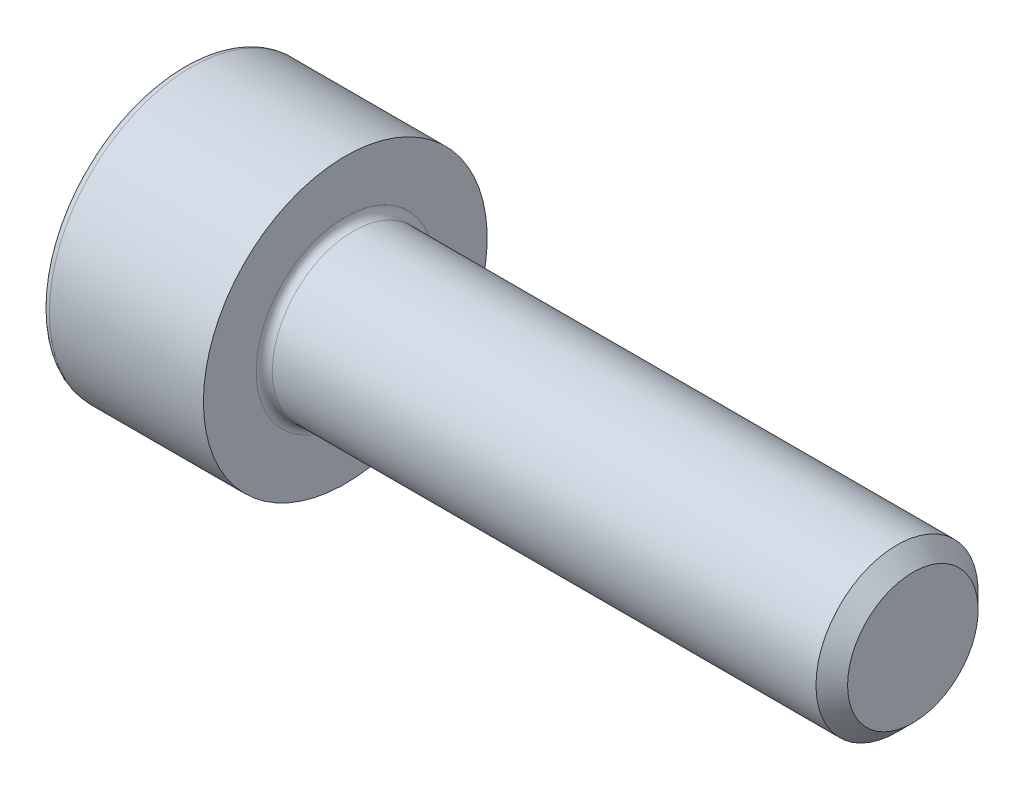
ISO-10303-21;
HEADER;
FILE_DESCRIPTION(('STEP AP214'),'2;1');
FILE_NAME('part.step','',(''),(''),'','','');
FILE_SCHEMA(('AUTOMOTIVE_DESIGN { 1 0 10303 214 1 1 1 1 }'));
ENDSEC;
DATA;
#1=APPLICATION_CONTEXT('core data for automotive mechanical design processes');
#2=APPLICATION_PROTOCOL_DEFINITION('international standard','automotive_design',2000,#1);
#3=PRODUCT_CONTEXT('',#1,'mechanical');
#4=PRODUCT('Part','Part','',(#3));
#5=PRODUCT_RELATED_PRODUCT_CATEGORY('part','',(#4));
#6=PRODUCT_DEFINITION_FORMATION('','',#4);
#7=PRODUCT_DEFINITION_CONTEXT('part definition',#1,'design');
#8=PRODUCT_DEFINITION('design','',#6,#7);
#9=PRODUCT_DEFINITION_SHAPE('','',#8);
#10=(LENGTH_UNIT() NAMED_UNIT(*) SI_UNIT(.MILLI.,.METRE.));
#11=(NAMED_UNIT(*) PLANE_ANGLE_UNIT() SI_UNIT($,.RADIAN.));
#12=(NAMED_UNIT(*) SI_UNIT($,.STERADIAN.) SOLID_ANGLE_UNIT());
#13=UNCERTAINTY_MEASURE_WITH_UNIT(LENGTH_MEASURE(1.E-05),#10,'distance_accuracy_value','');
#14=(GEOMETRIC_REPRESENTATION_CONTEXT(3) GLOBAL_UNCERTAINTY_ASSIGNED_CONTEXT((#13)) GLOBAL_UNIT_ASSIGNED_CONTEXT((#10,
#11,#12)) REPRESENTATION_CONTEXT('',''));
#15=CARTESIAN_POINT('',(0.,0.,0.));
#16=DIRECTION('',(0.,0.,1.));
#17=DIRECTION('',(1.,0.,0.));
#18=AXIS2_PLACEMENT_3D('',#15,#16,#17);
#19=CARTESIAN_POINT('',(2.,0.,0.));
#20=DIRECTION('',(-1.,0.,0.));
#21=DIRECTION('',(0.,0.,1.));
#22=AXIS2_PLACEMENT_3D('',#19,#20,#21);
#23=PLANE('',#22);
#24=DIRECTION('',(0.,-1.,0.));
#25=VECTOR('',#24,1.);
#26=CARTESIAN_POINT('',(2.,0.886521338340666,-1.5355));
#27=LINE('',#26,#25);
#28=CARTESIAN_POINT('',(2.,0.886521338340666,-1.5355));
#29=VERTEX_POINT('',#28);
#30=CARTESIAN_POINT('',(2.,0.,-1.5355));
#31=VERTEX_POINT('',#30);
#32=EDGE_CURVE('E174',#29,#31,#27,.T.);
#33=ORIENTED_EDGE('',*,*,#32,.T.);
#34=CARTESIAN_POINT('',(2.,0.,0.));
#35=DIRECTION('',(1.,0.,0.));
#36=DIRECTION('',(0.,0.,-1.));
#37=AXIS2_PLACEMENT_3D('',#34,#35,#36);
#38=CIRCLE('',#37,1.5355);
#39=CARTESIAN_POINT('',(2.,1.329782007511,-0.767750000000004));
#40=VERTEX_POINT('',#39);
#41=EDGE_CURVE('E47',#31,#40,#38,.T.);
#42=ORIENTED_EDGE('',*,*,#41,.T.);
#43=DIRECTION('',(0.,-0.500000000000003,-0.866025403784437));
#44=VECTOR('',#43,1.);
#45=CARTESIAN_POINT('',(2.,1.77304267668134,0.));
#46=LINE('',#45,#44);
#47=EDGE_CURVE('E170',#40,#29,#46,.T.);
#48=ORIENTED_EDGE('',*,*,#47,.T.);
#49=EDGE_LOOP('',(#33,#42,#48));
#50=FACE_BOUND('',#49,.T.);
#51=ADVANCED_FACE('F32',(#50),#23,.T.);
#52=CARTESIAN_POINT('',(2.,1.77304267668134,0.));
#53=VERTEX_POINT('',#52);
#54=EDGE_CURVE('E171',#53,#40,#46,.T.);
#55=ORIENTED_EDGE('',*,*,#54,.T.);
#56=CARTESIAN_POINT('',(2.,1.32978200751101,0.767749999999999));
#57=VERTEX_POINT('',#56);
#58=EDGE_CURVE('E210',#40,#57,#38,.T.);
#59=ORIENTED_EDGE('',*,*,#58,.T.);
#60=DIRECTION('',(0.,0.499999999999999,-0.866025403784439));
#61=VECTOR('',#60,1.);
#62=CARTESIAN_POINT('',(2.,0.886521338340669,1.5355));
#63=LINE('',#62,#61);
#64=EDGE_CURVE('E166',#57,#53,#63,.T.);
#65=ORIENTED_EDGE('',*,*,#64,.T.);
#66=EDGE_LOOP('',(#55,#59,#65));
#67=FACE_BOUND('',#66,.T.);
#68=ADVANCED_FACE('F122',(#67),#23,.T.);
#69=CARTESIAN_POINT('',(2.,0.886521338340669,1.5355));
#70=VERTEX_POINT('',#69);
#71=EDGE_CURVE('E167',#70,#57,#63,.T.);
#72=ORIENTED_EDGE('',*,*,#71,.T.);
#73=CARTESIAN_POINT('',(2.,0.,1.5355));
#74=VERTEX_POINT('',#73);
#75=EDGE_CURVE('E284',#57,#74,#38,.T.);
#76=ORIENTED_EDGE('',*,*,#75,.T.);
#77=DIRECTION('',(0.,1.,0.));
#78=VECTOR('',#77,1.);
#79=CARTESIAN_POINT('',(2.,-0.886521338340673,1.5355));
#80=LINE('',#79,#78);
#81=EDGE_CURVE('E162',#74,#70,#80,.T.);
#82=ORIENTED_EDGE('',*,*,#81,.T.);
#83=EDGE_LOOP('',(#72,#76,#82));
#84=FACE_BOUND('',#83,.T.);
#85=ADVANCED_FACE('F128',(#84),#23,.T.);
#86=CARTESIAN_POINT('',(2.,-0.886521338340673,1.5355));
#87=VERTEX_POINT('',#86);
#88=EDGE_CURVE('E163',#87,#74,#80,.T.);
#89=ORIENTED_EDGE('',*,*,#88,.T.);
#90=CARTESIAN_POINT('',(2.,-1.32978200751101,0.767750000000001));
#91=VERTEX_POINT('',#90);
#92=EDGE_CURVE('E283',#74,#91,#38,.T.);
#93=ORIENTED_EDGE('',*,*,#92,.T.);
#94=DIRECTION('',(0.,0.500000000000001,0.866025403784438));
#95=VECTOR('',#94,1.);
#96=CARTESIAN_POINT('',(2.,-1.77304267668134,0.));
#97=LINE('',#96,#95);
#98=EDGE_CURVE('E153',#91,#87,#97,.T.);
#99=ORIENTED_EDGE('',*,*,#98,.T.);
#100=EDGE_LOOP('',(#89,#93,#99));
#101=FACE_BOUND('',#100,.T.);
#102=ADVANCED_FACE('F143',(#101),#23,.T.);
#103=CARTESIAN_POINT('',(2.,-1.77304267668134,0.));
#104=VERTEX_POINT('',#103);
#105=EDGE_CURVE('E156',#104,#91,#97,.T.);
#106=ORIENTED_EDGE('',*,*,#105,.T.);
#107=CARTESIAN_POINT('',(2.,-1.32978200751101,-0.76775));
#108=VERTEX_POINT('',#107);
#109=EDGE_CURVE('E281',#91,#108,#38,.T.);
#110=ORIENTED_EDGE('',*,*,#109,.T.);
#111=DIRECTION('',(0.,-0.5,0.866025403784439));
#112=VECTOR('',#111,1.);
#113=CARTESIAN_POINT('',(2.,-0.886521338340676,-1.5355));
#114=LINE('',#113,#112);
#115=EDGE_CURVE('E154',#108,#104,#114,.T.);
#116=ORIENTED_EDGE('',*,*,#115,.T.);
#117=EDGE_LOOP('',(#106,#110,#116));
#118=FACE_BOUND('',#117,.T.);
#119=ADVANCED_FACE('F134',(#118),#23,.T.);
#120=CARTESIAN_POINT('',(2.,-0.886521338340676,-1.5355));
#121=VERTEX_POINT('',#120);
#122=EDGE_CURVE('E147',#121,#108,#114,.T.);
#123=ORIENTED_EDGE('',*,*,#122,.T.);
#124=EDGE_CURVE('E148',#108,#31,#38,.T.);
#125=ORIENTED_EDGE('',*,*,#124,.T.);
#126=EDGE_CURVE('E150',#31,#121,#27,.T.);
#127=ORIENTED_EDGE('',*,*,#126,.T.);
#128=EDGE_LOOP('',(#123,#125,#127));
#129=FACE_BOUND('',#128,.T.);
#130=ADVANCED_FACE('F124',(#129),#23,.T.);
#131=CARTESIAN_POINT('',(4.,3.5,0.));
#132=DIRECTION('',(1.,0.,0.));
#133=DIRECTION('',(0.,0.,-1.));
#134=AXIS2_PLACEMENT_3D('',#131,#132,#133);
#135=PLANE('',#134);
#136=CARTESIAN_POINT('',(4.,0.,0.));
#137=DIRECTION('',(1.,0.,0.));
#138=DIRECTION('',(0.,0.,-1.));
#139=AXIS2_PLACEMENT_3D('',#136,#137,#138);
#140=CIRCLE('',#139,2.19999999999996);
#141=CARTESIAN_POINT('',(4.,0.,-2.19999999999996));
#142=VERTEX_POINT('',#141);
#143=EDGE_CURVE('E11',#142,#142,#140,.F.);
#144=ORIENTED_EDGE('',*,*,#143,.T.);
#145=EDGE_LOOP('',(#144));
#146=FACE_BOUND('',#145,.T.);
#147=CARTESIAN_POINT('',(4.,0.,0.));
#148=DIRECTION('',(-1.,0.,0.));
#149=DIRECTION('',(0.,0.,1.));
#150=AXIS2_PLACEMENT_3D('',#147,#148,#149);
#151=CIRCLE('',#150,3.5);
#152=CARTESIAN_POINT('',(4.,0.,3.5));
#153=VERTEX_POINT('',#152);
#154=EDGE_CURVE('E194',#153,#153,#151,.T.);
#155=ORIENTED_EDGE('',*,*,#154,.F.);
#156=EDGE_LOOP('',(#155));
#157=FACE_BOUND('',#156,.T.);
#158=ADVANCED_FACE('F133',(#146,#157),#135,.T.);
#159=CARTESIAN_POINT('',(4.,0.,0.));
#160=DIRECTION('',(-1.,0.,0.));
#161=DIRECTION('',(0.,0.,1.));
#162=AXIS2_PLACEMENT_3D('',#159,#160,#161);
#163=CYLINDRICAL_SURFACE('',#162,3.5);
#164=CARTESIAN_POINT('',(0.2,0.,0.));
#165=DIRECTION('',(-1.,0.,0.));
#166=DIRECTION('',(0.,0.,1.));
#167=AXIS2_PLACEMENT_3D('',#164,#165,#166);
#168=CIRCLE('',#167,3.5);
#169=CARTESIAN_POINT('',(0.2,0.,3.5));
#170=VERTEX_POINT('',#169);
#171=EDGE_CURVE('E216',#170,#170,#168,.F.);
#172=ORIENTED_EDGE('',*,*,#171,.T.);
#173=EDGE_LOOP('',(#172));
#174=FACE_BOUND('',#173,.T.);
#175=ORIENTED_EDGE('',*,*,#154,.T.);
#176=EDGE_LOOP('',(#175));
#177=FACE_BOUND('',#176,.T.);
#178=ADVANCED_FACE('F140',(#174,#177),#163,.T.);
#179=CARTESIAN_POINT('',(0.,0.,0.));
#180=DIRECTION('',(-1.,0.,0.));
#181=DIRECTION('',(0.,0.,1.));
#182=AXIS2_PLACEMENT_3D('',#179,#180,#181);
#183=PLANE('',#182);
#184=CARTESIAN_POINT('',(0.,0.,0.));
#185=DIRECTION('',(-1.,0.,0.));
#186=DIRECTION('',(0.,0.,1.));
#187=AXIS2_PLACEMENT_3D('',#184,#185,#186);
#188=CIRCLE('',#187,3.3);
#189=CARTESIAN_POINT('',(0.,0.,3.3));
#190=VERTEX_POINT('',#189);
#191=EDGE_CURVE('E213',#190,#190,#188,.T.);
#192=ORIENTED_EDGE('',*,*,#191,.T.);
#193=EDGE_LOOP('',(#192));
#194=FACE_BOUND('',#193,.T.);
#195=DIRECTION('',(0.,-0.5,0.866025403784439));
#196=VECTOR('',#195,1.);
#197=CARTESIAN_POINT('',(0.,-0.886521338340676,-1.5355));
#198=LINE('',#197,#196);
#199=CARTESIAN_POINT('',(0.,-0.886521338340676,-1.5355));
#200=VERTEX_POINT('',#199);
#201=CARTESIAN_POINT('',(0.,-1.77304267668135,0.));
#202=VERTEX_POINT('',#201);
#203=EDGE_CURVE('E55',#200,#202,#198,.T.);
#204=ORIENTED_EDGE('',*,*,#203,.F.);
#205=DIRECTION('',(0.,-1.,0.));
#206=VECTOR('',#205,1.);
#207=CARTESIAN_POINT('',(0.,0.886521338340666,-1.5355));
#208=LINE('',#207,#206);
#209=CARTESIAN_POINT('',(0.,0.886521338340666,-1.5355));
#210=VERTEX_POINT('',#209);
#211=EDGE_CURVE('E158',#210,#200,#208,.T.);
#212=ORIENTED_EDGE('',*,*,#211,.F.);
#213=DIRECTION('',(0.,-0.500000000000003,-0.866025403784437));
#214=VECTOR('',#213,1.);
#215=CARTESIAN_POINT('',(0.,1.77304267668134,0.));
#216=LINE('',#215,#214);
#217=CARTESIAN_POINT('',(0.,1.77304267668134,0.));
#218=VERTEX_POINT('',#217);
#219=EDGE_CURVE('E187',#218,#210,#216,.T.);
#220=ORIENTED_EDGE('',*,*,#219,.F.);
#221=DIRECTION('',(0.,0.499999999999999,-0.866025403784439));
#222=VECTOR('',#221,1.);
#223=CARTESIAN_POINT('',(0.,0.886521338340669,1.5355));
#224=LINE('',#223,#222);
#225=CARTESIAN_POINT('',(0.,0.886521338340669,1.5355));
#226=VERTEX_POINT('',#225);
#227=EDGE_CURVE('E184',#226,#218,#224,.T.);
#228=ORIENTED_EDGE('',*,*,#227,.F.);
#229=DIRECTION('',(0.,1.,0.));
#230=VECTOR('',#229,1.);
#231=CARTESIAN_POINT('',(0.,-0.886521338340673,1.5355));
#232=LINE('',#231,#230);
#233=CARTESIAN_POINT('',(0.,-0.886521338340673,1.5355));
#234=VERTEX_POINT('',#233);
#235=EDGE_CURVE('E181',#234,#226,#232,.T.);
#236=ORIENTED_EDGE('',*,*,#235,.F.);
#237=DIRECTION('',(0.,0.500000000000001,0.866025403784438));
#238=VECTOR('',#237,1.);
#239=CARTESIAN_POINT('',(0.,-1.77304267668134,0.));
#240=LINE('',#239,#238);
#241=EDGE_CURVE('E178',#202,#234,#240,.T.);
#242=ORIENTED_EDGE('',*,*,#241,.F.);
#243=EDGE_LOOP('',(#204,#212,#220,#228,#236,#242));
#244=FACE_BOUND('',#243,.T.);
#245=ADVANCED_FACE('F235',(#194,#244),#183,.T.);
#246=CARTESIAN_POINT('',(18.,0.,0.));
#247=DIRECTION('',(-1.,0.,0.));
#248=DIRECTION('',(0.,0.,1.));
#249=AXIS2_PLACEMENT_3D('',#246,#247,#248);
#250=CYLINDRICAL_SURFACE('',#249,1.99999999999996);
#251=CARTESIAN_POINT('',(4.2,0.,0.));
#252=DIRECTION('',(1.,0.,0.));
#253=DIRECTION('',(0.,0.,-1.));
#254=AXIS2_PLACEMENT_3D('',#251,#252,#253);
#255=CIRCLE('',#254,1.99999999999996);
#256=CARTESIAN_POINT('',(4.2,0.,1.99999999999996));
#257=VERTEX_POINT('',#256);
#258=EDGE_CURVE('E40',#257,#257,#255,.T.);
#259=CARTESIAN_POINT('',(17.6100000000001,0.,0.));
#260=DIRECTION('',(1.,0.,0.));
#261=DIRECTION('',(0.,0.,-1.));
#262=AXIS2_PLACEMENT_3D('',#259,#260,#261);
#263=CIRCLE('',#262,1.99999999999996);
#264=CARTESIAN_POINT('',(17.6100000000001,0.,1.99999999999996));
#265=VERTEX_POINT('',#264);
#266=EDGE_CURVE('E209',#265,#265,#263,.F.);
#267=CARTESIAN_POINT('',(4.2,0.,1.99999999999996));
#268=CARTESIAN_POINT('',(4.3396875,0.,1.99999999999996));
#269=CARTESIAN_POINT('',(4.479375,0.,1.99999999999996));
#270=CARTESIAN_POINT('',(4.75875,0.,1.99999999999996));
#271=CARTESIAN_POINT('',(4.8984375,0.,1.99999999999996));
#272=CARTESIAN_POINT('',(5.17781250000001,0.,1.99999999999996));
#273=CARTESIAN_POINT('',(5.31750000000001,0.,1.99999999999996));
#274=CARTESIAN_POINT('',(5.59687500000001,0.,1.99999999999996));
#275=CARTESIAN_POINT('',(5.73656250000001,0.,1.99999999999996));
#276=CARTESIAN_POINT('',(6.01593750000001,0.,1.99999999999996));
#277=CARTESIAN_POINT('',(6.15562500000002,0.,1.99999999999996));
#278=CARTESIAN_POINT('',(6.43500000000002,0.,1.99999999999996));
#279=CARTESIAN_POINT('',(6.57468750000002,0.,1.99999999999996));
#280=CARTESIAN_POINT('',(6.85406250000002,0.,1.99999999999996));
#281=CARTESIAN_POINT('',(6.99375000000003,0.,1.99999999999996));
#282=CARTESIAN_POINT('',(7.27312500000003,0.,1.99999999999996));
#283=CARTESIAN_POINT('',(7.41281250000003,0.,1.99999999999996));
#284=CARTESIAN_POINT('',(7.69218750000003,0.,1.99999999999996));
#285=CARTESIAN_POINT('',(7.83187500000003,0.,1.99999999999996));
#286=CARTESIAN_POINT('',(8.11125000000004,0.,1.99999999999996));
#287=CARTESIAN_POINT('',(8.25093750000004,0.,1.99999999999996));
#288=CARTESIAN_POINT('',(8.53031250000004,0.,1.99999999999996));
#289=CARTESIAN_POINT('',(8.67000000000004,0.,1.99999999999996));
#290=CARTESIAN_POINT('',(8.94937500000004,0.,1.99999999999996));
#291=CARTESIAN_POINT('',(9.08906250000005,0.,1.99999999999996));
#292=CARTESIAN_POINT('',(9.36843750000005,0.,1.99999999999996));
#293=CARTESIAN_POINT('',(9.50812500000005,0.,1.99999999999996));
#294=CARTESIAN_POINT('',(9.78750000000005,0.,1.99999999999996));
#295=CARTESIAN_POINT('',(9.92718750000006,0.,1.99999999999996));
#296=CARTESIAN_POINT('',(10.2065625000001,0.,1.99999999999996));
#297=CARTESIAN_POINT('',(10.3462500000001,0.,1.99999999999996));
#298=CARTESIAN_POINT('',(10.6256250000001,0.,1.99999999999996));
#299=CARTESIAN_POINT('',(10.7653125000001,0.,1.99999999999996));
#300=CARTESIAN_POINT('',(11.0446875000001,0.,1.99999999999996));
#301=CARTESIAN_POINT('',(11.1843750000001,0.,1.99999999999996));
#302=CARTESIAN_POINT('',(11.4637500000001,0.,1.99999999999996));
#303=CARTESIAN_POINT('',(11.6034375000001,0.,1.99999999999996));
#304=CARTESIAN_POINT('',(11.8828125000001,0.,1.99999999999996));
#305=CARTESIAN_POINT('',(12.0225000000001,0.,1.99999999999996));
#306=CARTESIAN_POINT('',(12.3018750000001,0.,1.99999999999996));
#307=CARTESIAN_POINT('',(12.4415625000001,0.,1.99999999999996));
#308=CARTESIAN_POINT('',(12.7209375000001,0.,1.99999999999996));
#309=CARTESIAN_POINT('',(12.8606250000001,0.,1.99999999999996));
#310=CARTESIAN_POINT('',(13.1400000000001,0.,1.99999999999996));
#311=CARTESIAN_POINT('',(13.2796875000001,0.,1.99999999999996));
#312=CARTESIAN_POINT('',(13.5590625000001,0.,1.99999999999996));
#313=CARTESIAN_POINT('',(13.6987500000001,0.,1.99999999999996));
#314=CARTESIAN_POINT('',(13.9781250000001,0.,1.99999999999996));
#315=CARTESIAN_POINT('',(14.1178125000001,0.,1.99999999999996));
#316=CARTESIAN_POINT('',(14.3971875000001,0.,1.99999999999996));
#317=CARTESIAN_POINT('',(14.5368750000001,0.,1.99999999999996));
#318=CARTESIAN_POINT('',(14.8162500000001,0.,1.99999999999996));
#319=CARTESIAN_POINT('',(14.9559375000001,0.,1.99999999999996));
#320=CARTESIAN_POINT('',(15.2353125000001,0.,1.99999999999996));
#321=CARTESIAN_POINT('',(15.3750000000001,0.,1.99999999999996));
#322=CARTESIAN_POINT('',(15.6543750000001,0.,1.99999999999996));
#323=CARTESIAN_POINT('',(15.7940625000001,0.,1.99999999999996));
#324=CARTESIAN_POINT('',(16.0734375000001,0.,1.99999999999996));
#325=CARTESIAN_POINT('',(16.2131250000001,0.,1.99999999999996));
#326=CARTESIAN_POINT('',(16.4925000000001,0.,1.99999999999996));
#327=CARTESIAN_POINT('',(16.6321875000001,0.,1.99999999999996));
#328=CARTESIAN_POINT('',(16.9115625000001,0.,1.99999999999996));
#329=CARTESIAN_POINT('',(17.0512500000001,0.,1.99999999999996));
#330=CARTESIAN_POINT('',(17.3306250000001,0.,1.99999999999996));
#331=CARTESIAN_POINT('',(17.4703125000001,0.,1.99999999999996));
#332=CARTESIAN_POINT('',(17.6100000000001,0.,1.99999999999996));
#333=B_SPLINE_CURVE_WITH_KNOTS('',3,(#267,#268,#269,#270,#271,#272,#273,#274,#275,#276,#277,
#278,#279,#280,#281,#282,#283,#284,#285,#286,#287,#288,#289,#290,#291,#292,#293,#294,#295,#296,
#297,#298,#299,#300,#301,#302,#303,#304,#305,#306,#307,#308,#309,#310,#311,#312,#313,#314,#315,
#316,#317,#318,#319,#320,#321,#322,#323,#324,#325,#326,#327,#328,#329,#330,#331,#332),
.UNSPECIFIED.,.F.,.F.,(4,2,2,2,2,2,2,2,2,2,2,2,2,2,2,2,2,2,2,2,2,2,2,2,2,2,2,2,2,2,2,2,4),(0.,
0.419062500000005,0.838125000000009,1.25718750000001,1.67625000000002,2.09531250000002,
2.51437500000003,2.93343750000003,3.35250000000003,3.77156250000004,4.19062500000004,
4.60968750000005,5.02875000000005,5.44781250000006,5.86687500000006,6.28593750000006,
6.70500000000007,7.12406250000007,7.54312500000008,7.96218750000008,8.38125000000008,
8.80031250000009,9.21937500000009,9.63843750000009,10.0575000000001,10.4765625000001,
10.8956250000001,11.3146875000001,11.7337500000001,12.1528125000001,12.5718750000001,
12.9909375000001,13.4100000000001),.UNSPECIFIED.);
#334=EDGE_CURVE('BSEAM221',#257,#265,#333,.T.);
#335=ORIENTED_EDGE('',*,*,#258,.T.);
#336=ORIENTED_EDGE('',*,*,#266,.T.);
#337=ORIENTED_EDGE('',*,*,#334,.T.);
#338=ORIENTED_EDGE('',*,*,#334,.F.);
#339=EDGE_LOOP('',(#335,#337,#336,#338));
#340=FACE_BOUND('',#339,.T.);
#341=ADVANCED_FACE('F221',(#340),#250,.T.);
#342=CARTESIAN_POINT('',(18.,0.,0.));
#343=DIRECTION('',(1.,0.,0.));
#344=DIRECTION('',(0.,0.,-1.));
#345=AXIS2_PLACEMENT_3D('',#342,#343,#344);
#346=PLANE('',#345);
#347=CARTESIAN_POINT('',(18.,0.,0.));
#348=DIRECTION('',(1.,0.,0.));
#349=DIRECTION('',(0.,0.,-1.));
#350=AXIS2_PLACEMENT_3D('',#347,#348,#349);
#351=CIRCLE('',#350,1.60999999999994);
#352=CARTESIAN_POINT('',(18.,0.,1.60999999999994));
#353=VERTEX_POINT('',#352);
#354=EDGE_CURVE('E206',#353,#353,#351,.T.);
#355=ORIENTED_EDGE('',*,*,#354,.T.);
#356=EDGE_LOOP('',(#355));
#357=FACE_BOUND('',#356,.T.);
#358=ADVANCED_FACE('F246',(#357),#346,.T.);
#359=CARTESIAN_POINT('',(2.,-0.886521338340676,-1.5355));
#360=DIRECTION('',(0.,-0.866025403784439,-0.5));
#361=DIRECTION('',(0.,0.5,-0.866025403784439));
#362=AXIS2_PLACEMENT_3D('',#359,#360,#361);
#363=PLANE('',#362);
#364=ORIENTED_EDGE('',*,*,#203,.T.);
#365=DIRECTION('',(-1.,0.,0.));
#366=VECTOR('',#365,1.);
#367=CARTESIAN_POINT('',(2.,-1.77304267668134,0.));
#368=LINE('',#367,#366);
#369=EDGE_CURVE('E176',#104,#202,#368,.T.);
#370=ORIENTED_EDGE('',*,*,#369,.F.);
#371=ORIENTED_EDGE('',*,*,#115,.F.);
#372=ORIENTED_EDGE('',*,*,#122,.F.);
#373=DIRECTION('',(-1.,0.,0.));
#374=VECTOR('',#373,1.);
#375=CARTESIAN_POINT('',(2.,-0.886521338340676,-1.5355));
#376=LINE('',#375,#374);
#377=EDGE_CURVE('E192',#121,#200,#376,.T.);
#378=ORIENTED_EDGE('',*,*,#377,.T.);
#379=EDGE_LOOP('',(#364,#370,#371,#372,#378));
#380=FACE_BOUND('',#379,.T.);
#381=ADVANCED_FACE('F249',(#380),#363,.F.);
#382=CARTESIAN_POINT('',(2.,0.886521338340666,-1.5355));
#383=DIRECTION('',(0.,0.,-1.));
#384=DIRECTION('',(-1.,0.,0.));
#385=AXIS2_PLACEMENT_3D('',#382,#383,#384);
#386=PLANE('',#385);
#387=ORIENTED_EDGE('',*,*,#211,.T.);
#388=ORIENTED_EDGE('',*,*,#377,.F.);
#389=ORIENTED_EDGE('',*,*,#126,.F.);
#390=ORIENTED_EDGE('',*,*,#32,.F.);
#391=DIRECTION('',(-1.,0.,0.));
#392=VECTOR('',#391,1.);
#393=CARTESIAN_POINT('',(2.,0.886521338340666,-1.5355));
#394=LINE('',#393,#392);
#395=EDGE_CURVE('E195',#29,#210,#394,.T.);
#396=ORIENTED_EDGE('',*,*,#395,.T.);
#397=EDGE_LOOP('',(#387,#388,#389,#390,#396));
#398=FACE_BOUND('',#397,.T.);
#399=ADVANCED_FACE('F252',(#398),#386,.F.);
#400=CARTESIAN_POINT('',(2.,1.77304267668134,0.));
#401=DIRECTION('',(0.,0.866025403784437,-0.500000000000003));
#402=DIRECTION('',(0.,0.500000000000003,0.866025403784437));
#403=AXIS2_PLACEMENT_3D('',#400,#401,#402);
#404=PLANE('',#403);
#405=ORIENTED_EDGE('',*,*,#219,.T.);
#406=ORIENTED_EDGE('',*,*,#395,.F.);
#407=ORIENTED_EDGE('',*,*,#47,.F.);
#408=ORIENTED_EDGE('',*,*,#54,.F.);
#409=DIRECTION('',(-1.,0.,0.));
#410=VECTOR('',#409,1.);
#411=CARTESIAN_POINT('',(2.,1.77304267668134,0.));
#412=LINE('',#411,#410);
#413=EDGE_CURVE('E197',#53,#218,#412,.T.);
#414=ORIENTED_EDGE('',*,*,#413,.T.);
#415=EDGE_LOOP('',(#405,#406,#407,#408,#414));
#416=FACE_BOUND('',#415,.T.);
#417=ADVANCED_FACE('F260',(#416),#404,.F.);
#418=CARTESIAN_POINT('',(2.,0.886521338340669,1.5355));
#419=DIRECTION('',(0.,0.866025403784439,0.499999999999999));
#420=DIRECTION('',(0.,-0.499999999999999,0.866025403784439));
#421=AXIS2_PLACEMENT_3D('',#418,#419,#420);
#422=PLANE('',#421);
#423=ORIENTED_EDGE('',*,*,#227,.T.);
#424=ORIENTED_EDGE('',*,*,#413,.F.);
#425=ORIENTED_EDGE('',*,*,#64,.F.);
#426=ORIENTED_EDGE('',*,*,#71,.F.);
#427=DIRECTION('',(-1.,0.,0.));
#428=VECTOR('',#427,1.);
#429=CARTESIAN_POINT('',(2.,0.886521338340669,1.5355));
#430=LINE('',#429,#428);
#431=EDGE_CURVE('E199',#70,#226,#430,.T.);
#432=ORIENTED_EDGE('',*,*,#431,.T.);
#433=EDGE_LOOP('',(#423,#424,#425,#426,#432));
#434=FACE_BOUND('',#433,.T.);
#435=ADVANCED_FACE('F256',(#434),#422,.F.);
#436=CARTESIAN_POINT('',(2.,-0.886521338340673,1.5355));
#437=DIRECTION('',(0.,0.,1.));
#438=DIRECTION('',(1.,0.,0.));
#439=AXIS2_PLACEMENT_3D('',#436,#437,#438);
#440=PLANE('',#439);
#441=ORIENTED_EDGE('',*,*,#235,.T.);
#442=ORIENTED_EDGE('',*,*,#431,.F.);
#443=ORIENTED_EDGE('',*,*,#81,.F.);
#444=ORIENTED_EDGE('',*,*,#88,.F.);
#445=DIRECTION('',(-1.,0.,0.));
#446=VECTOR('',#445,1.);
#447=CARTESIAN_POINT('',(2.,-0.886521338340673,1.5355));
#448=LINE('',#447,#446);
#449=EDGE_CURVE('E201',#87,#234,#448,.T.);
#450=ORIENTED_EDGE('',*,*,#449,.T.);
#451=EDGE_LOOP('',(#441,#442,#443,#444,#450));
#452=FACE_BOUND('',#451,.T.);
#453=ADVANCED_FACE('F117',(#452),#440,.F.);
#454=CARTESIAN_POINT('',(2.,-1.77304267668134,0.));
#455=DIRECTION('',(0.,-0.866025403784438,0.500000000000001));
#456=DIRECTION('',(0.,-0.500000000000001,-0.866025403784438));
#457=AXIS2_PLACEMENT_3D('',#454,#455,#456);
#458=PLANE('',#457);
#459=ORIENTED_EDGE('',*,*,#241,.T.);
#460=ORIENTED_EDGE('',*,*,#449,.F.);
#461=ORIENTED_EDGE('',*,*,#98,.F.);
#462=ORIENTED_EDGE('',*,*,#105,.F.);
#463=ORIENTED_EDGE('',*,*,#369,.T.);
#464=EDGE_LOOP('',(#459,#460,#461,#462,#463));
#465=FACE_BOUND('',#464,.T.);
#466=ADVANCED_FACE('F108',(#465),#458,.F.);
#467=CARTESIAN_POINT('',(2.88652133834068,0.,0.));
#468=DIRECTION('',(-1.,0.,0.));
#469=DIRECTION('',(0.,0.,1.));
#470=AXIS2_PLACEMENT_3D('',#467,#468,#469);
#471=CONICAL_SURFACE('',#470,0.,1.04719755119659);
#472=ORIENTED_EDGE('',*,*,#41,.F.);
#473=ORIENTED_EDGE('',*,*,#124,.F.);
#474=ORIENTED_EDGE('',*,*,#109,.F.);
#475=ORIENTED_EDGE('',*,*,#92,.F.);
#476=ORIENTED_EDGE('',*,*,#75,.F.);
#477=ORIENTED_EDGE('',*,*,#58,.F.);
#478=EDGE_LOOP('',(#472,#473,#474,#475,#476,#477));
#479=FACE_BOUND('',#478,.T.);
#480=CARTESIAN_POINT('',(2.88652133834068,0.,0.));
#481=VERTEX_POINT('',#480);
#482=VERTEX_LOOP('',#481);
#483=FACE_BOUND('',#482,.T.);
#484=ADVANCED_FACE('F105',(#479,#483),#471,.F.);
#485=CARTESIAN_POINT('',(18.,0.,0.));
#486=DIRECTION('',(-1.,0.,0.));
#487=DIRECTION('',(0.,0.,1.));
#488=AXIS2_PLACEMENT_3D('',#485,#486,#487);
#489=CONICAL_SURFACE('',#488,1.60999999999994,0.785398163397651);
#490=CARTESIAN_POINT('',(17.6100000000001,0.,1.99999999999996));
#491=CARTESIAN_POINT('',(17.6140625000001,0.,1.99593749999996));
#492=CARTESIAN_POINT('',(17.6181250000001,0.,1.99187499999996));
#493=CARTESIAN_POINT('',(17.6262500000001,0.,1.98374999999996));
#494=CARTESIAN_POINT('',(17.6303125000001,0.,1.97968749999996));
#495=CARTESIAN_POINT('',(17.6384375000001,0.,1.97156249999996));
#496=CARTESIAN_POINT('',(17.6425000000001,0.,1.96749999999996));
#497=CARTESIAN_POINT('',(17.6506250000001,0.,1.95937499999996));
#498=CARTESIAN_POINT('',(17.6546875000001,0.,1.95531249999996));
#499=CARTESIAN_POINT('',(17.6628125000001,0.,1.94718749999996));
#500=CARTESIAN_POINT('',(17.6668750000001,0.,1.94312499999996));
#501=CARTESIAN_POINT('',(17.6750000000001,0.,1.93499999999996));
#502=CARTESIAN_POINT('',(17.6790625000001,0.,1.93093749999996));
#503=CARTESIAN_POINT('',(17.6871875000001,0.,1.92281249999996));
#504=CARTESIAN_POINT('',(17.6912500000001,0.,1.91874999999996));
#505=CARTESIAN_POINT('',(17.6993750000001,0.,1.91062499999996));
#506=CARTESIAN_POINT('',(17.7034375000001,0.,1.90656249999996));
#507=CARTESIAN_POINT('',(17.7115625000001,0.,1.89843749999996));
#508=CARTESIAN_POINT('',(17.7156250000001,0.,1.89437499999996));
#509=CARTESIAN_POINT('',(17.7237500000001,0.,1.88624999999996));
#510=CARTESIAN_POINT('',(17.7278125000001,0.,1.88218749999995));
#511=CARTESIAN_POINT('',(17.7359375000001,0.,1.87406249999995));
#512=CARTESIAN_POINT('',(17.7400000000001,0.,1.86999999999995));
#513=CARTESIAN_POINT('',(17.7481250000001,0.,1.86187499999995));
#514=CARTESIAN_POINT('',(17.7521875000001,0.,1.85781249999995));
#515=CARTESIAN_POINT('',(17.7603125000001,0.,1.84968749999995));
#516=CARTESIAN_POINT('',(17.7643750000001,0.,1.84562499999995));
#517=CARTESIAN_POINT('',(17.7725000000001,0.,1.83749999999995));
#518=CARTESIAN_POINT('',(17.7765625000001,0.,1.83343749999995));
#519=CARTESIAN_POINT('',(17.7846875000001,0.,1.82531249999995));
#520=CARTESIAN_POINT('',(17.7887500000001,0.,1.82124999999995));
#521=CARTESIAN_POINT('',(17.7968750000001,0.,1.81312499999995));
#522=CARTESIAN_POINT('',(17.8009375000001,0.,1.80906249999995));
#523=CARTESIAN_POINT('',(17.8090625000001,0.,1.80093749999995));
#524=CARTESIAN_POINT('',(17.8131250000001,0.,1.79687499999995));
#525=CARTESIAN_POINT('',(17.8212500000001,0.,1.78874999999995));
#526=CARTESIAN_POINT('',(17.8253125000001,0.,1.78468749999995));
#527=CARTESIAN_POINT('',(17.8334375000001,0.,1.77656249999995));
#528=CARTESIAN_POINT('',(17.8375000000001,0.,1.77249999999995));
#529=CARTESIAN_POINT('',(17.845625,0.,1.76437499999995));
#530=CARTESIAN_POINT('',(17.8496875,0.,1.76031249999995));
#531=CARTESIAN_POINT('',(17.8578125,0.,1.75218749999995));
#532=CARTESIAN_POINT('',(17.861875,0.,1.74812499999995));
#533=CARTESIAN_POINT('',(17.87,0.,1.73999999999995));
#534=CARTESIAN_POINT('',(17.8740625,0.,1.73593749999995));
#535=CARTESIAN_POINT('',(17.8821875,0.,1.72781249999995));
#536=CARTESIAN_POINT('',(17.88625,0.,1.72374999999994));
#537=CARTESIAN_POINT('',(17.894375,0.,1.71562499999994));
#538=CARTESIAN_POINT('',(17.8984375,0.,1.71156249999994));
#539=CARTESIAN_POINT('',(17.9065625,0.,1.70343749999994));
#540=CARTESIAN_POINT('',(17.910625,0.,1.69937499999994));
#541=CARTESIAN_POINT('',(17.91875,0.,1.69124999999994));
#542=CARTESIAN_POINT('',(17.9228125,0.,1.68718749999994));
#543=CARTESIAN_POINT('',(17.9309375,0.,1.67906249999994));
#544=CARTESIAN_POINT('',(17.935,0.,1.67499999999994));
#545=CARTESIAN_POINT('',(17.943125,0.,1.66687499999994));
#546=CARTESIAN_POINT('',(17.9471875,0.,1.66281249999994));
#547=CARTESIAN_POINT('',(17.9553125,0.,1.65468749999994));
#548=CARTESIAN_POINT('',(17.959375,0.,1.65062499999994));
#549=CARTESIAN_POINT('',(17.9675,0.,1.64249999999994));
#550=CARTESIAN_POINT('',(17.9715625,0.,1.63843749999994));
#551=CARTESIAN_POINT('',(17.9796875,0.,1.63031249999994));
#552=CARTESIAN_POINT('',(17.98375,0.,1.62624999999994));
#553=CARTESIAN_POINT('',(17.991875,0.,1.61812499999994));
#554=CARTESIAN_POINT('',(17.9959375,0.,1.61406249999994));
#555=CARTESIAN_POINT('',(18.,0.,1.60999999999994));
#556=B_SPLINE_CURVE_WITH_KNOTS('',3,(#490,#491,#492,#493,#494,#495,#496,#497,#498,#499,#500,
#501,#502,#503,#504,#505,#506,#507,#508,#509,#510,#511,#512,#513,#514,#515,#516,#517,#518,#519,
#520,#521,#522,#523,#524,#525,#526,#527,#528,#529,#530,#531,#532,#533,#534,#535,#536,#537,#538,
#539,#540,#541,#542,#543,#544,#545,#546,#547,#548,#549,#550,#551,#552,#553,#554,#555),
.UNSPECIFIED.,.F.,.F.,(4,2,2,2,2,2,2,2,2,2,2,2,2,2,2,2,2,2,2,2,2,2,2,2,2,2,2,2,2,2,2,2,4),(0.,
0.01723572779142,0.0344714555828403,0.0517071833742607,0.0689429111656808,0.0861786389570985,
0.103414366748519,0.120650094539939,0.137885822331359,0.155121550122779,0.172357277914197,
0.189593005705617,0.206828733497038,0.224064461288458,0.241300189079876,0.258535916871296,
0.275771644662716,0.293007372454136,0.310243100245556,0.327478828036974,0.344714555828394,
0.361950283619815,0.379186011411235,0.396421739202653,0.413657466994073,0.430893194785493,
0.448128922576913,0.465364650368334,0.482600378159751,0.499836105951172,0.517071833742592,
0.534307561534012,0.551543289325432),.UNSPECIFIED.);
#557=EDGE_CURVE('BSEAM107',#265,#353,#556,.T.);
#558=ORIENTED_EDGE('',*,*,#266,.F.);
#559=ORIENTED_EDGE('',*,*,#354,.F.);
#560=ORIENTED_EDGE('',*,*,#557,.T.);
#561=ORIENTED_EDGE('',*,*,#557,.F.);
#562=EDGE_LOOP('',(#558,#560,#559,#561));
#563=FACE_BOUND('',#562,.T.);
#564=ADVANCED_FACE('F107',(#563),#489,.T.);
#565=CARTESIAN_POINT('',(0.2,0.,0.));
#566=DIRECTION('',(-1.,0.,0.));
#567=DIRECTION('',(0.,0.,1.));
#568=AXIS2_PLACEMENT_3D('',#565,#566,#567);
#569=TOROIDAL_SURFACE('',#568,3.3,0.2);
#570=ORIENTED_EDGE('',*,*,#171,.F.);
#571=EDGE_LOOP('',(#570));
#572=FACE_BOUND('',#571,.T.);
#573=ORIENTED_EDGE('',*,*,#191,.F.);
#574=EDGE_LOOP('',(#573));
#575=FACE_BOUND('',#574,.T.);
#576=ADVANCED_FACE('F114',(#572,#575),#569,.T.);
#577=CARTESIAN_POINT('',(4.2,0.,0.));
#578=DIRECTION('',(1.,0.,0.));
#579=DIRECTION('',(0.,0.,-1.));
#580=AXIS2_PLACEMENT_3D('',#577,#578,#579);
#581=TOROIDAL_SURFACE('',#580,2.19999999999996,0.2);
#582=ORIENTED_EDGE('',*,*,#143,.F.);
#583=EDGE_LOOP('',(#582));
#584=FACE_BOUND('',#583,.T.);
#585=ORIENTED_EDGE('',*,*,#258,.F.);
#586=EDGE_LOOP('',(#585));
#587=FACE_BOUND('',#586,.T.);
#588=ADVANCED_FACE('F34',(#584,#587),#581,.F.);
#589=CLOSED_SHELL('',(#51,#68,#85,#102,#119,#130,#158,#178,#245,#341,#358,#381,#399,#417,#435,
#453,#466,#484,#564,#576,#588));
#590=MANIFOLD_SOLID_BREP('B2',#589);
#591=ADVANCED_BREP_SHAPE_REPRESENTATION('',(#18,#590),#14);
#592=SHAPE_DEFINITION_REPRESENTATION(#9,#591);
ENDSEC;
END-ISO-10303-21;
